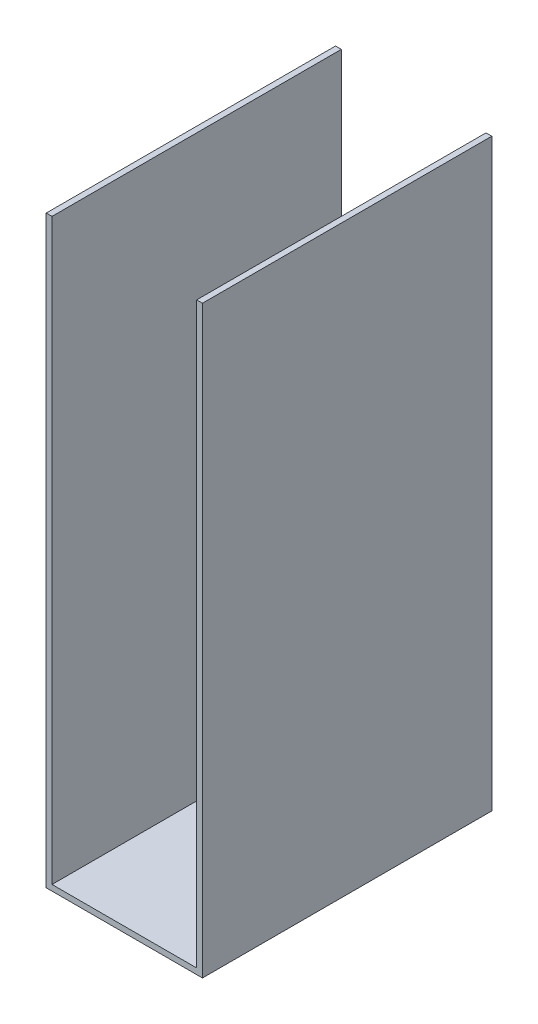
ISO-10303-21;
HEADER;
FILE_DESCRIPTION(('STEP AP214'),'2;1');
FILE_NAME('part.step','',(''),(''),'','','');
FILE_SCHEMA(('AUTOMOTIVE_DESIGN { 1 0 10303 214 1 1 1 1 }'));
ENDSEC;
DATA;
#1=APPLICATION_CONTEXT('core data for automotive mechanical design processes');
#2=APPLICATION_PROTOCOL_DEFINITION('international standard','automotive_design',2000,#1);
#3=PRODUCT_CONTEXT('',#1,'mechanical');
#4=PRODUCT('Part','Part','',(#3));
#5=PRODUCT_RELATED_PRODUCT_CATEGORY('part','',(#4));
#6=PRODUCT_DEFINITION_FORMATION('','',#4);
#7=PRODUCT_DEFINITION_CONTEXT('part definition',#1,'design');
#8=PRODUCT_DEFINITION('design','',#6,#7);
#9=PRODUCT_DEFINITION_SHAPE('','',#8);
#10=(LENGTH_UNIT() NAMED_UNIT(*) SI_UNIT(.MILLI.,.METRE.));
#11=(NAMED_UNIT(*) PLANE_ANGLE_UNIT() SI_UNIT($,.RADIAN.));
#12=(NAMED_UNIT(*) SI_UNIT($,.STERADIAN.) SOLID_ANGLE_UNIT());
#13=UNCERTAINTY_MEASURE_WITH_UNIT(LENGTH_MEASURE(1.E-05),#10,'distance_accuracy_value','');
#14=(GEOMETRIC_REPRESENTATION_CONTEXT(3) GLOBAL_UNCERTAINTY_ASSIGNED_CONTEXT((#13)) GLOBAL_UNIT_ASSIGNED_CONTEXT((#10,
#11,#12)) REPRESENTATION_CONTEXT('',''));
#15=CARTESIAN_POINT('',(0.,0.,0.));
#16=DIRECTION('',(0.,0.,1.));
#17=DIRECTION('',(1.,0.,0.));
#18=AXIS2_PLACEMENT_3D('',#15,#16,#17);
#19=CARTESIAN_POINT('',(-200.,0.,10000.));
#20=DIRECTION('',(0.,-1.,0.));
#21=DIRECTION('',(0.,0.,-1.));
#22=AXIS2_PLACEMENT_3D('',#19,#20,#21);
#23=PLANE('',#22);
#24=DIRECTION('',(-1.,0.,0.));
#25=VECTOR('',#24,1.);
#26=CARTESIAN_POINT('',(-200.,0.,0.));
#27=LINE('',#26,#25);
#28=CARTESIAN_POINT('',(0.,0.,0.));
#29=VERTEX_POINT('',#28);
#30=CARTESIAN_POINT('',(-200.,0.,0.));
#31=VERTEX_POINT('',#30);
#32=EDGE_CURVE('E144',#29,#31,#27,.T.);
#33=ORIENTED_EDGE('',*,*,#32,.T.);
#34=DIRECTION('',(0.,0.,-1.));
#35=VECTOR('',#34,1.);
#36=CARTESIAN_POINT('',(-200.,0.,10000.));
#37=LINE('',#36,#35);
#38=CARTESIAN_POINT('',(-200.,0.,10000.));
#39=VERTEX_POINT('',#38);
#40=EDGE_CURVE('E11',#39,#31,#37,.T.);
#41=ORIENTED_EDGE('',*,*,#40,.F.);
#42=DIRECTION('',(-1.,0.,0.));
#43=VECTOR('',#42,1.);
#44=CARTESIAN_POINT('',(-200.,0.,10000.));
#45=LINE('',#44,#43);
#46=CARTESIAN_POINT('',(0.,0.,10000.));
#47=VERTEX_POINT('',#46);
#48=EDGE_CURVE('E166',#47,#39,#45,.T.);
#49=ORIENTED_EDGE('',*,*,#48,.F.);
#50=DIRECTION('',(0.,0.,-1.));
#51=VECTOR('',#50,1.);
#52=CARTESIAN_POINT('',(0.,0.,10000.));
#53=LINE('',#52,#51);
#54=EDGE_CURVE('E140',#47,#29,#53,.T.);
#55=ORIENTED_EDGE('',*,*,#54,.T.);
#56=EDGE_LOOP('',(#33,#41,#49,#55));
#57=FACE_BOUND('',#56,.T.);
#58=ADVANCED_FACE('F43',(#57),#23,.F.);
#59=CARTESIAN_POINT('',(-200.,0.,10000.));
#60=DIRECTION('',(1.,0.,0.));
#61=DIRECTION('',(0.,1.,0.));
#62=AXIS2_PLACEMENT_3D('',#59,#60,#61);
#63=PLANE('',#62);
#64=DIRECTION('',(0.,-1.,0.));
#65=VECTOR('',#64,1.);
#66=CARTESIAN_POINT('',(-200.,0.,0.));
#67=LINE('',#66,#65);
#68=CARTESIAN_POINT('',(-199.999999999997,-20200.,0.));
#69=VERTEX_POINT('',#68);
#70=EDGE_CURVE('E148',#31,#69,#67,.T.);
#71=ORIENTED_EDGE('',*,*,#70,.T.);
#72=DIRECTION('',(0.,0.,-1.));
#73=VECTOR('',#72,1.);
#74=CARTESIAN_POINT('',(-199.999999999997,-20200.,10000.));
#75=LINE('',#74,#73);
#76=CARTESIAN_POINT('',(-199.999999999997,-20200.,10000.));
#77=VERTEX_POINT('',#76);
#78=EDGE_CURVE('E52',#77,#69,#75,.T.);
#79=ORIENTED_EDGE('',*,*,#78,.F.);
#80=DIRECTION('',(0.,-1.,0.));
#81=VECTOR('',#80,1.);
#82=CARTESIAN_POINT('',(-200.,0.,10000.));
#83=LINE('',#82,#81);
#84=EDGE_CURVE('E103',#39,#77,#83,.T.);
#85=ORIENTED_EDGE('',*,*,#84,.F.);
#86=ORIENTED_EDGE('',*,*,#40,.T.);
#87=EDGE_LOOP('',(#71,#79,#85,#86));
#88=FACE_BOUND('',#87,.T.);
#89=ADVANCED_FACE('F212',(#88),#63,.F.);
#90=CARTESIAN_POINT('',(-199.999999999997,-20200.,10000.));
#91=DIRECTION('',(0.,1.,0.));
#92=DIRECTION('',(0.,0.,1.));
#93=AXIS2_PLACEMENT_3D('',#90,#91,#92);
#94=PLANE('',#93);
#95=DIRECTION('',(1.,0.,0.));
#96=VECTOR('',#95,1.);
#97=CARTESIAN_POINT('',(-199.999999999997,-20200.,0.));
#98=LINE('',#97,#96);
#99=CARTESIAN_POINT('',(5200.,-20200.,0.));
#100=VERTEX_POINT('',#99);
#101=EDGE_CURVE('E151',#69,#100,#98,.T.);
#102=ORIENTED_EDGE('',*,*,#101,.T.);
#103=DIRECTION('',(0.,0.,-1.));
#104=VECTOR('',#103,1.);
#105=CARTESIAN_POINT('',(5200.,-20200.,10000.));
#106=LINE('',#105,#104);
#107=CARTESIAN_POINT('',(5200.,-20200.,10000.));
#108=VERTEX_POINT('',#107);
#109=EDGE_CURVE('E177',#108,#100,#106,.T.);
#110=ORIENTED_EDGE('',*,*,#109,.F.);
#111=DIRECTION('',(1.,0.,0.));
#112=VECTOR('',#111,1.);
#113=CARTESIAN_POINT('',(-199.999999999997,-20200.,10000.));
#114=LINE('',#113,#112);
#115=EDGE_CURVE('E187',#77,#108,#114,.T.);
#116=ORIENTED_EDGE('',*,*,#115,.F.);
#117=ORIENTED_EDGE('',*,*,#78,.T.);
#118=EDGE_LOOP('',(#102,#110,#116,#117));
#119=FACE_BOUND('',#118,.T.);
#120=ADVANCED_FACE('F185',(#119),#94,.F.);
#121=CARTESIAN_POINT('',(5200.,-20200.,10000.));
#122=DIRECTION('',(-1.,0.,0.));
#123=DIRECTION('',(0.,0.,1.));
#124=AXIS2_PLACEMENT_3D('',#121,#122,#123);
#125=PLANE('',#124);
#126=DIRECTION('',(0.,1.,0.));
#127=VECTOR('',#126,1.);
#128=CARTESIAN_POINT('',(5200.,-20200.,0.));
#129=LINE('',#128,#127);
#130=CARTESIAN_POINT('',(5200.,0.,0.));
#131=VERTEX_POINT('',#130);
#132=EDGE_CURVE('E154',#100,#131,#129,.T.);
#133=ORIENTED_EDGE('',*,*,#132,.T.);
#134=DIRECTION('',(0.,0.,-1.));
#135=VECTOR('',#134,1.);
#136=CARTESIAN_POINT('',(5200.,0.,10000.));
#137=LINE('',#136,#135);
#138=CARTESIAN_POINT('',(5200.,0.,10000.));
#139=VERTEX_POINT('',#138);
#140=EDGE_CURVE('E173',#139,#131,#137,.T.);
#141=ORIENTED_EDGE('',*,*,#140,.F.);
#142=DIRECTION('',(0.,1.,0.));
#143=VECTOR('',#142,1.);
#144=CARTESIAN_POINT('',(5200.,-20200.,10000.));
#145=LINE('',#144,#143);
#146=EDGE_CURVE('E200',#108,#139,#145,.T.);
#147=ORIENTED_EDGE('',*,*,#146,.F.);
#148=ORIENTED_EDGE('',*,*,#109,.T.);
#149=EDGE_LOOP('',(#133,#141,#147,#148));
#150=FACE_BOUND('',#149,.T.);
#151=ADVANCED_FACE('F195',(#150),#125,.F.);
#152=CARTESIAN_POINT('',(5000.,0.,10000.));
#153=DIRECTION('',(0.,-1.,0.));
#154=DIRECTION('',(0.,0.,-1.));
#155=AXIS2_PLACEMENT_3D('',#152,#153,#154);
#156=PLANE('',#155);
#157=DIRECTION('',(-1.,0.,0.));
#158=VECTOR('',#157,1.);
#159=CARTESIAN_POINT('',(5000.,0.,0.));
#160=LINE('',#159,#158);
#161=CARTESIAN_POINT('',(5000.,0.,0.));
#162=VERTEX_POINT('',#161);
#163=EDGE_CURVE('E157',#131,#162,#160,.T.);
#164=ORIENTED_EDGE('',*,*,#163,.T.);
#165=DIRECTION('',(0.,0.,-1.));
#166=VECTOR('',#165,1.);
#167=CARTESIAN_POINT('',(5000.,0.,10000.));
#168=LINE('',#167,#166);
#169=CARTESIAN_POINT('',(5000.,0.,10000.));
#170=VERTEX_POINT('',#169);
#171=EDGE_CURVE('E133',#170,#162,#168,.T.);
#172=ORIENTED_EDGE('',*,*,#171,.F.);
#173=DIRECTION('',(-1.,0.,0.));
#174=VECTOR('',#173,1.);
#175=CARTESIAN_POINT('',(5000.,0.,10000.));
#176=LINE('',#175,#174);
#177=EDGE_CURVE('E122',#139,#170,#176,.T.);
#178=ORIENTED_EDGE('',*,*,#177,.F.);
#179=ORIENTED_EDGE('',*,*,#140,.T.);
#180=EDGE_LOOP('',(#164,#172,#178,#179));
#181=FACE_BOUND('',#180,.T.);
#182=ADVANCED_FACE('F198',(#181),#156,.F.);
#183=CARTESIAN_POINT('',(5000.,-20000.,10000.));
#184=DIRECTION('',(1.,0.,0.));
#185=DIRECTION('',(0.,0.,-1.));
#186=AXIS2_PLACEMENT_3D('',#183,#184,#185);
#187=PLANE('',#186);
#188=DIRECTION('',(0.,-1.,0.));
#189=VECTOR('',#188,1.);
#190=CARTESIAN_POINT('',(5000.,-20000.,0.));
#191=LINE('',#190,#189);
#192=CARTESIAN_POINT('',(5000.,-20000.,0.));
#193=VERTEX_POINT('',#192);
#194=EDGE_CURVE('E131',#162,#193,#191,.T.);
#195=ORIENTED_EDGE('',*,*,#194,.T.);
#196=DIRECTION('',(0.,0.,-1.));
#197=VECTOR('',#196,1.);
#198=CARTESIAN_POINT('',(5000.,-20000.,10000.));
#199=LINE('',#198,#197);
#200=CARTESIAN_POINT('',(5000.,-20000.,10000.));
#201=VERTEX_POINT('',#200);
#202=EDGE_CURVE('E128',#201,#193,#199,.T.);
#203=ORIENTED_EDGE('',*,*,#202,.F.);
#204=DIRECTION('',(0.,-1.,0.));
#205=VECTOR('',#204,1.);
#206=CARTESIAN_POINT('',(5000.,-20000.,10000.));
#207=LINE('',#206,#205);
#208=EDGE_CURVE('E116',#170,#201,#207,.T.);
#209=ORIENTED_EDGE('',*,*,#208,.F.);
#210=ORIENTED_EDGE('',*,*,#171,.T.);
#211=EDGE_LOOP('',(#195,#203,#209,#210));
#212=FACE_BOUND('',#211,.T.);
#213=ADVANCED_FACE('F129',(#212),#187,.F.);
#214=CARTESIAN_POINT('',(2.44929359829471E-12,-20000.,10000.));
#215=DIRECTION('',(0.,-1.,0.));
#216=DIRECTION('',(0.,0.,-1.));
#217=AXIS2_PLACEMENT_3D('',#214,#215,#216);
#218=PLANE('',#217);
#219=DIRECTION('',(-1.,0.,0.));
#220=VECTOR('',#219,1.);
#221=CARTESIAN_POINT('',(2.44929359829471E-12,-20000.,0.));
#222=LINE('',#221,#220);
#223=CARTESIAN_POINT('',(2.44929359829471E-12,-20000.,0.));
#224=VERTEX_POINT('',#223);
#225=EDGE_CURVE('E89',#193,#224,#222,.T.);
#226=ORIENTED_EDGE('',*,*,#225,.T.);
#227=DIRECTION('',(0.,0.,-1.));
#228=VECTOR('',#227,1.);
#229=CARTESIAN_POINT('',(2.44929359829471E-12,-20000.,10000.));
#230=LINE('',#229,#228);
#231=CARTESIAN_POINT('',(2.44929359829471E-12,-20000.,10000.));
#232=VERTEX_POINT('',#231);
#233=EDGE_CURVE('E134',#232,#224,#230,.T.);
#234=ORIENTED_EDGE('',*,*,#233,.F.);
#235=DIRECTION('',(-1.,0.,0.));
#236=VECTOR('',#235,1.);
#237=CARTESIAN_POINT('',(2.44929359829471E-12,-20000.,10000.));
#238=LINE('',#237,#236);
#239=EDGE_CURVE('E120',#201,#232,#238,.T.);
#240=ORIENTED_EDGE('',*,*,#239,.F.);
#241=ORIENTED_EDGE('',*,*,#202,.T.);
#242=EDGE_LOOP('',(#226,#234,#240,#241));
#243=FACE_BOUND('',#242,.T.);
#244=ADVANCED_FACE('F136',(#243),#218,.F.);
#245=CARTESIAN_POINT('',(0.,0.,10000.));
#246=DIRECTION('',(-1.,0.,0.));
#247=DIRECTION('',(0.,-1.,0.));
#248=AXIS2_PLACEMENT_3D('',#245,#246,#247);
#249=PLANE('',#248);
#250=DIRECTION('',(0.,1.,0.));
#251=VECTOR('',#250,1.);
#252=CARTESIAN_POINT('',(0.,0.,0.));
#253=LINE('',#252,#251);
#254=EDGE_CURVE('E95',#224,#29,#253,.T.);
#255=ORIENTED_EDGE('',*,*,#254,.T.);
#256=ORIENTED_EDGE('',*,*,#54,.F.);
#257=DIRECTION('',(0.,1.,0.));
#258=VECTOR('',#257,1.);
#259=CARTESIAN_POINT('',(0.,0.,10000.));
#260=LINE('',#259,#258);
#261=EDGE_CURVE('E60',#232,#47,#260,.T.);
#262=ORIENTED_EDGE('',*,*,#261,.F.);
#263=ORIENTED_EDGE('',*,*,#233,.T.);
#264=EDGE_LOOP('',(#255,#256,#262,#263));
#265=FACE_BOUND('',#264,.T.);
#266=ADVANCED_FACE('F228',(#265),#249,.F.);
#267=CARTESIAN_POINT('',(0.,0.,10000.));
#268=DIRECTION('',(0.,0.,-1.));
#269=DIRECTION('',(-1.,0.,0.));
#270=AXIS2_PLACEMENT_3D('',#267,#268,#269);
#271=PLANE('',#270);
#272=ORIENTED_EDGE('',*,*,#48,.T.);
#273=ORIENTED_EDGE('',*,*,#84,.T.);
#274=ORIENTED_EDGE('',*,*,#115,.T.);
#275=ORIENTED_EDGE('',*,*,#146,.T.);
#276=ORIENTED_EDGE('',*,*,#177,.T.);
#277=ORIENTED_EDGE('',*,*,#208,.T.);
#278=ORIENTED_EDGE('',*,*,#239,.T.);
#279=ORIENTED_EDGE('',*,*,#261,.T.);
#280=EDGE_LOOP('',(#272,#273,#274,#275,#276,#277,#278,#279));
#281=FACE_BOUND('',#280,.T.);
#282=ADVANCED_FACE('F118',(#281),#271,.F.);
#283=CARTESIAN_POINT('',(0.,0.,0.));
#284=DIRECTION('',(0.,0.,-1.));
#285=DIRECTION('',(-1.,0.,0.));
#286=AXIS2_PLACEMENT_3D('',#283,#284,#285);
#287=PLANE('',#286);
#288=ORIENTED_EDGE('',*,*,#32,.F.);
#289=ORIENTED_EDGE('',*,*,#254,.F.);
#290=ORIENTED_EDGE('',*,*,#225,.F.);
#291=ORIENTED_EDGE('',*,*,#194,.F.);
#292=ORIENTED_EDGE('',*,*,#163,.F.);
#293=ORIENTED_EDGE('',*,*,#132,.F.);
#294=ORIENTED_EDGE('',*,*,#101,.F.);
#295=ORIENTED_EDGE('',*,*,#70,.F.);
#296=EDGE_LOOP('',(#288,#289,#290,#291,#292,#293,#294,#295));
#297=FACE_BOUND('',#296,.T.);
#298=ADVANCED_FACE('F191',(#297),#287,.T.);
#299=CLOSED_SHELL('',(#58,#89,#120,#151,#182,#213,#244,#266,#282,#298));
#300=MANIFOLD_SOLID_BREP('B2',#299);
#301=ADVANCED_BREP_SHAPE_REPRESENTATION('',(#18,#300),#14);
#302=SHAPE_DEFINITION_REPRESENTATION(#9,#301);
ENDSEC;
END-ISO-10303-21;
